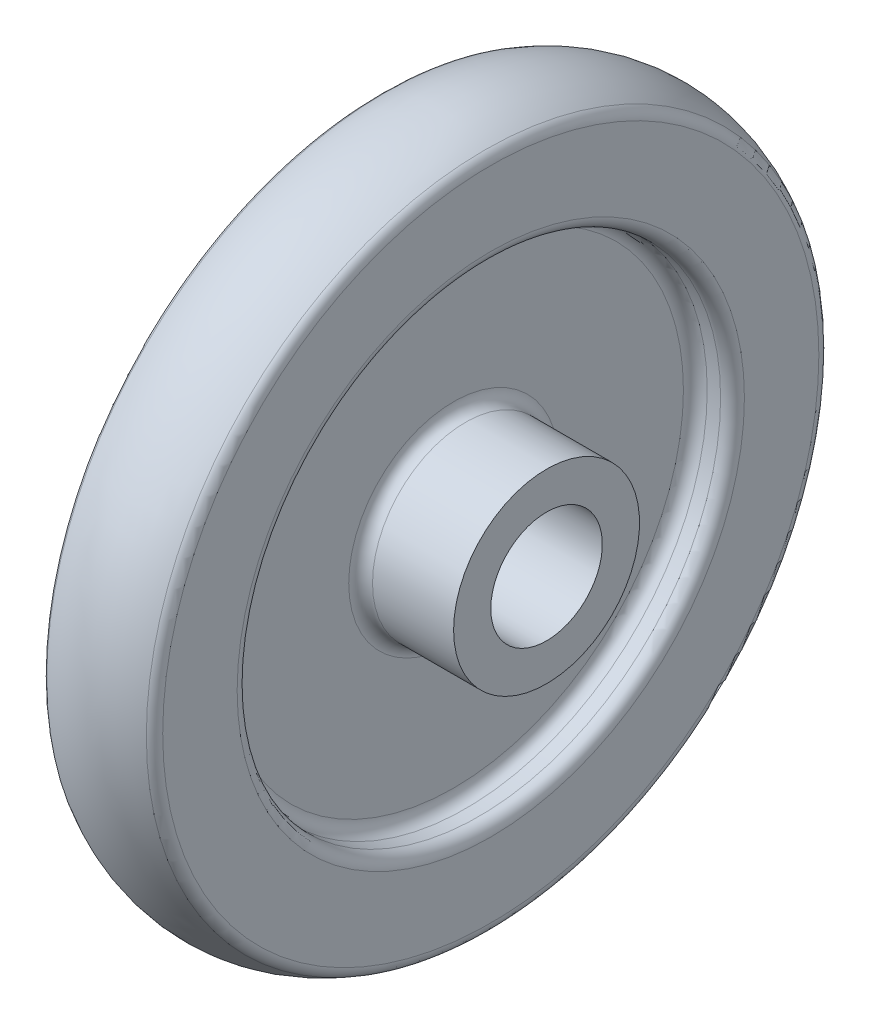
ISO-10303-21;
HEADER;
FILE_DESCRIPTION(('STEP AP214'),'2;1');
FILE_NAME('part.step','',(''),(''),'','','');
FILE_SCHEMA(('AUTOMOTIVE_DESIGN { 1 0 10303 214 1 1 1 1 }'));
ENDSEC;
DATA;
#1=APPLICATION_CONTEXT('core data for automotive mechanical design processes');
#2=APPLICATION_PROTOCOL_DEFINITION('international standard','automotive_design',2000,#1);
#3=PRODUCT_CONTEXT('',#1,'mechanical');
#4=PRODUCT('Part','Part','',(#3));
#5=PRODUCT_RELATED_PRODUCT_CATEGORY('part','',(#4));
#6=PRODUCT_DEFINITION_FORMATION('','',#4);
#7=PRODUCT_DEFINITION_CONTEXT('part definition',#1,'design');
#8=PRODUCT_DEFINITION('design','',#6,#7);
#9=PRODUCT_DEFINITION_SHAPE('','',#8);
#10=(LENGTH_UNIT() NAMED_UNIT(*) SI_UNIT(.MILLI.,.METRE.));
#11=(NAMED_UNIT(*) PLANE_ANGLE_UNIT() SI_UNIT($,.RADIAN.));
#12=(NAMED_UNIT(*) SI_UNIT($,.STERADIAN.) SOLID_ANGLE_UNIT());
#13=UNCERTAINTY_MEASURE_WITH_UNIT(LENGTH_MEASURE(1.E-05),#10,'distance_accuracy_value','');
#14=(GEOMETRIC_REPRESENTATION_CONTEXT(3) GLOBAL_UNCERTAINTY_ASSIGNED_CONTEXT((#13)) GLOBAL_UNIT_ASSIGNED_CONTEXT((#10,
#11,#12)) REPRESENTATION_CONTEXT('',''));
#15=CARTESIAN_POINT('',(0.,0.,0.));
#16=DIRECTION('',(0.,0.,1.));
#17=DIRECTION('',(1.,0.,0.));
#18=AXIS2_PLACEMENT_3D('',#15,#16,#17);
#19=CARTESIAN_POINT('',(0.,9.52500000000001,0.));
#20=DIRECTION('',(1.,0.,0.));
#21=DIRECTION('',(0.,0.,-1.));
#22=AXIS2_PLACEMENT_3D('',#19,#20,#21);
#23=PLANE('',#22);
#24=CARTESIAN_POINT('',(0.,0.,0.));
#25=DIRECTION('',(-1.,0.,0.));
#26=DIRECTION('',(0.,0.,1.));
#27=AXIS2_PLACEMENT_3D('',#24,#25,#26);
#28=CIRCLE('',#27,9.525);
#29=CARTESIAN_POINT('',(0.,0.,9.525));
#30=VERTEX_POINT('',#29);
#31=EDGE_CURVE('E95',#30,#30,#28,.T.);
#32=ORIENTED_EDGE('',*,*,#31,.F.);
#33=EDGE_LOOP('',(#32));
#34=FACE_BOUND('',#33,.T.);
#35=CARTESIAN_POINT('',(0.,0.,0.));
#36=DIRECTION('',(-1.,0.,0.));
#37=DIRECTION('',(0.,0.,1.));
#38=AXIS2_PLACEMENT_3D('',#35,#36,#37);
#39=CIRCLE('',#38,15.875);
#40=CARTESIAN_POINT('',(0.,0.,15.875));
#41=VERTEX_POINT('',#40);
#42=EDGE_CURVE('E10',#41,#41,#39,.T.);
#43=ORIENTED_EDGE('',*,*,#42,.T.);
#44=EDGE_LOOP('',(#43));
#45=FACE_BOUND('',#44,.T.);
#46=ADVANCED_FACE('F31',(#34,#45),#23,.F.);
#47=CARTESIAN_POINT('',(0.,0.,0.));
#48=DIRECTION('',(-1.,0.,0.));
#49=DIRECTION('',(0.,0.,1.));
#50=AXIS2_PLACEMENT_3D('',#47,#48,#49);
#51=CYLINDRICAL_SURFACE('',#50,15.875);
#52=ORIENTED_EDGE('',*,*,#42,.F.);
#53=EDGE_LOOP('',(#52));
#54=FACE_BOUND('',#53,.T.);
#55=CARTESIAN_POINT('',(13.843,0.,0.));
#56=DIRECTION('',(-1.,0.,0.));
#57=DIRECTION('',(0.,0.,1.));
#58=AXIS2_PLACEMENT_3D('',#55,#56,#57);
#59=CIRCLE('',#58,15.875);
#60=CARTESIAN_POINT('',(13.843,0.,15.875));
#61=VERTEX_POINT('',#60);
#62=EDGE_CURVE('E37',#61,#61,#59,.T.);
#63=ORIENTED_EDGE('',*,*,#62,.T.);
#64=EDGE_LOOP('',(#63));
#65=FACE_BOUND('',#64,.T.);
#66=ADVANCED_FACE('F102',(#54,#65),#51,.T.);
#67=CARTESIAN_POINT('',(13.843,0.,0.));
#68=DIRECTION('',(-1.,0.,0.));
#69=DIRECTION('',(0.,0.,1.));
#70=AXIS2_PLACEMENT_3D('',#67,#68,#69);
#71=TOROIDAL_SURFACE('',#70,17.907,2.032);
#72=ORIENTED_EDGE('',*,*,#62,.F.);
#73=EDGE_LOOP('',(#72));
#74=FACE_BOUND('',#73,.T.);
#75=CARTESIAN_POINT('',(15.875,0.,0.));
#76=DIRECTION('',(-1.,0.,0.));
#77=DIRECTION('',(0.,0.,1.));
#78=AXIS2_PLACEMENT_3D('',#75,#76,#77);
#79=CIRCLE('',#78,17.907);
#80=CARTESIAN_POINT('',(15.875,0.,17.907));
#81=VERTEX_POINT('',#80);
#82=EDGE_CURVE('E41',#81,#81,#79,.T.);
#83=ORIENTED_EDGE('',*,*,#82,.T.);
#84=EDGE_LOOP('',(#83));
#85=FACE_BOUND('',#84,.T.);
#86=ADVANCED_FACE('F106',(#74,#85),#71,.F.);
#87=CARTESIAN_POINT('',(15.875,17.907,0.));
#88=DIRECTION('',(1.,0.,0.));
#89=DIRECTION('',(0.,0.,-1.));
#90=AXIS2_PLACEMENT_3D('',#87,#88,#89);
#91=PLANE('',#90);
#92=ORIENTED_EDGE('',*,*,#82,.F.);
#93=EDGE_LOOP('',(#92));
#94=FACE_BOUND('',#93,.T.);
#95=CARTESIAN_POINT('',(15.8750000000001,0.,0.));
#96=DIRECTION('',(-1.,0.,0.));
#97=DIRECTION('',(0.,0.,1.));
#98=AXIS2_PLACEMENT_3D('',#95,#96,#97);
#99=CIRCLE('',#98,39.243);
#100=CARTESIAN_POINT('',(15.8750000000001,0.,39.243));
#101=VERTEX_POINT('',#100);
#102=EDGE_CURVE('E45',#101,#101,#99,.T.);
#103=ORIENTED_EDGE('',*,*,#102,.T.);
#104=EDGE_LOOP('',(#103));
#105=FACE_BOUND('',#104,.T.);
#106=ADVANCED_FACE('F111',(#94,#105),#91,.F.);
#107=CARTESIAN_POINT('',(13.8430000000001,0.,0.));
#108=DIRECTION('',(-1.,0.,0.));
#109=DIRECTION('',(0.,0.,1.));
#110=AXIS2_PLACEMENT_3D('',#107,#108,#109);
#111=TOROIDAL_SURFACE('',#110,39.243,2.032);
#112=ORIENTED_EDGE('',*,*,#102,.F.);
#113=EDGE_LOOP('',(#112));
#114=FACE_BOUND('',#113,.T.);
#115=CARTESIAN_POINT('',(13.8430000000001,0.,0.));
#116=DIRECTION('',(-1.,0.,0.));
#117=DIRECTION('',(0.,0.,1.));
#118=AXIS2_PLACEMENT_3D('',#115,#116,#117);
#119=CIRCLE('',#118,41.275);
#120=CARTESIAN_POINT('',(13.8430000000001,0.,41.275));
#121=VERTEX_POINT('',#120);
#122=EDGE_CURVE('E50',#121,#121,#119,.T.);
#123=ORIENTED_EDGE('',*,*,#122,.T.);
#124=EDGE_LOOP('',(#123));
#125=FACE_BOUND('',#124,.T.);
#126=ADVANCED_FACE('F117',(#114,#125),#111,.F.);
#127=CARTESIAN_POINT('',(0.,0.,0.));
#128=DIRECTION('',(-1.,0.,0.));
#129=DIRECTION('',(0.,0.,1.));
#130=AXIS2_PLACEMENT_3D('',#127,#128,#129);
#131=CYLINDRICAL_SURFACE('',#130,41.275);
#132=ORIENTED_EDGE('',*,*,#122,.F.);
#133=EDGE_LOOP('',(#132));
#134=FACE_BOUND('',#133,.T.);
#135=CARTESIAN_POINT('',(11.557,0.,0.));
#136=DIRECTION('',(-1.,0.,0.));
#137=DIRECTION('',(0.,0.,1.));
#138=AXIS2_PLACEMENT_3D('',#135,#136,#137);
#139=CIRCLE('',#138,41.275);
#140=CARTESIAN_POINT('',(11.557,0.,41.275));
#141=VERTEX_POINT('',#140);
#142=EDGE_CURVE('E53',#141,#141,#139,.T.);
#143=ORIENTED_EDGE('',*,*,#142,.T.);
#144=EDGE_LOOP('',(#143));
#145=FACE_BOUND('',#144,.T.);
#146=ADVANCED_FACE('F121',(#134,#145),#131,.F.);
#147=CARTESIAN_POINT('',(11.557,0.,0.));
#148=DIRECTION('',(-1.,0.,0.));
#149=DIRECTION('',(0.,0.,1.));
#150=AXIS2_PLACEMENT_3D('',#147,#148,#149);
#151=TOROIDAL_SURFACE('',#150,43.307,2.032);
#152=ORIENTED_EDGE('',*,*,#142,.F.);
#153=EDGE_LOOP('',(#152));
#154=FACE_BOUND('',#153,.T.);
#155=CARTESIAN_POINT('',(9.525,0.,0.));
#156=DIRECTION('',(-1.,0.,0.));
#157=DIRECTION('',(0.,0.,1.));
#158=AXIS2_PLACEMENT_3D('',#155,#156,#157);
#159=CIRCLE('',#158,43.307);
#160=CARTESIAN_POINT('',(9.525,0.,43.307));
#161=VERTEX_POINT('',#160);
#162=EDGE_CURVE('E56',#161,#161,#159,.T.);
#163=ORIENTED_EDGE('',*,*,#162,.T.);
#164=EDGE_LOOP('',(#163));
#165=FACE_BOUND('',#164,.T.);
#166=ADVANCED_FACE('F125',(#154,#165),#151,.T.);
#167=CARTESIAN_POINT('',(9.52500000000001,43.307,0.));
#168=DIRECTION('',(1.,0.,0.));
#169=DIRECTION('',(0.,0.,-1.));
#170=AXIS2_PLACEMENT_3D('',#167,#168,#169);
#171=PLANE('',#170);
#172=ORIENTED_EDGE('',*,*,#162,.F.);
#173=EDGE_LOOP('',(#172));
#174=FACE_BOUND('',#173,.T.);
#175=CARTESIAN_POINT('',(9.52500000000001,0.,0.));
#176=DIRECTION('',(-1.,0.,0.));
#177=DIRECTION('',(0.,0.,1.));
#178=AXIS2_PLACEMENT_3D('',#175,#176,#177);
#179=CIRCLE('',#178,56.016390606059);
#180=CARTESIAN_POINT('',(9.52500000000001,0.,56.016390606059));
#181=VERTEX_POINT('',#180);
#182=EDGE_CURVE('E59',#181,#181,#179,.T.);
#183=ORIENTED_EDGE('',*,*,#182,.T.);
#184=EDGE_LOOP('',(#183));
#185=FACE_BOUND('',#184,.T.);
#186=ADVANCED_FACE('F129',(#174,#185),#171,.F.);
#187=CARTESIAN_POINT('',(11.557,0.,0.));
#188=DIRECTION('',(-1.,0.,0.));
#189=DIRECTION('',(0.,0.,1.));
#190=AXIS2_PLACEMENT_3D('',#187,#188,#189);
#191=TOROIDAL_SURFACE('',#190,56.016390606059,2.03199999999999);
#192=ORIENTED_EDGE('',*,*,#182,.F.);
#193=EDGE_LOOP('',(#192));
#194=FACE_BOUND('',#193,.T.);
#195=CARTESIAN_POINT('',(10.5529153281033,0.,0.));
#196=DIRECTION('',(-1.,0.,0.));
#197=DIRECTION('',(0.,0.,1.));
#198=AXIS2_PLACEMENT_3D('',#195,#196,#197);
#199=CIRCLE('',#198,57.7829799674167);
#200=CARTESIAN_POINT('',(10.5529153281033,0.,57.7829799674167));
#201=VERTEX_POINT('',#200);
#202=EDGE_CURVE('E62',#201,#201,#199,.T.);
#203=ORIENTED_EDGE('',*,*,#202,.T.);
#204=EDGE_LOOP('',(#203));
#205=FACE_BOUND('',#204,.T.);
#206=ADVANCED_FACE('F133',(#194,#205),#191,.T.);
#207=CARTESIAN_POINT('',(19.0500000000001,0.,0.));
#208=DIRECTION('',(-1.,0.,0.));
#209=DIRECTION('',(0.,0.,1.));
#210=AXIS2_PLACEMENT_3D('',#207,#208,#209);
#211=TOROIDAL_SURFACE('',#210,42.8331855884499,17.1958367023756);
#212=ORIENTED_EDGE('',*,*,#202,.F.);
#213=EDGE_LOOP('',(#212));
#214=FACE_BOUND('',#213,.T.);
#215=CARTESIAN_POINT('',(27.5470846718968,0.,0.));
#216=DIRECTION('',(-1.,0.,0.));
#217=DIRECTION('',(0.,0.,1.));
#218=AXIS2_PLACEMENT_3D('',#215,#216,#217);
#219=CIRCLE('',#218,57.7829799674167);
#220=CARTESIAN_POINT('',(27.5470846718968,0.,57.7829799674167));
#221=VERTEX_POINT('',#220);
#222=EDGE_CURVE('E65',#221,#221,#219,.T.);
#223=ORIENTED_EDGE('',*,*,#222,.T.);
#224=EDGE_LOOP('',(#223));
#225=FACE_BOUND('',#224,.T.);
#226=ADVANCED_FACE('F137',(#214,#225),#211,.T.);
#227=CARTESIAN_POINT('',(26.5430000000001,0.,0.));
#228=DIRECTION('',(-1.,0.,0.));
#229=DIRECTION('',(0.,0.,1.));
#230=AXIS2_PLACEMENT_3D('',#227,#228,#229);
#231=TOROIDAL_SURFACE('',#230,56.016390606059,2.03199999999999);
#232=ORIENTED_EDGE('',*,*,#222,.F.);
#233=EDGE_LOOP('',(#232));
#234=FACE_BOUND('',#233,.T.);
#235=CARTESIAN_POINT('',(28.5750000000001,0.,0.));
#236=DIRECTION('',(-1.,0.,0.));
#237=DIRECTION('',(0.,0.,1.));
#238=AXIS2_PLACEMENT_3D('',#235,#236,#237);
#239=CIRCLE('',#238,56.016390606059);
#240=CARTESIAN_POINT('',(28.5750000000001,0.,56.016390606059));
#241=VERTEX_POINT('',#240);
#242=EDGE_CURVE('E68',#241,#241,#239,.T.);
#243=ORIENTED_EDGE('',*,*,#242,.T.);
#244=EDGE_LOOP('',(#243));
#245=FACE_BOUND('',#244,.T.);
#246=ADVANCED_FACE('F141',(#234,#245),#231,.T.);
#247=CARTESIAN_POINT('',(28.5750000000001,43.307,0.));
#248=DIRECTION('',(-1.,0.,0.));
#249=DIRECTION('',(0.,0.,1.));
#250=AXIS2_PLACEMENT_3D('',#247,#248,#249);
#251=PLANE('',#250);
#252=ORIENTED_EDGE('',*,*,#242,.F.);
#253=EDGE_LOOP('',(#252));
#254=FACE_BOUND('',#253,.T.);
#255=CARTESIAN_POINT('',(28.5750000000001,0.,0.));
#256=DIRECTION('',(-1.,0.,0.));
#257=DIRECTION('',(0.,0.,1.));
#258=AXIS2_PLACEMENT_3D('',#255,#256,#257);
#259=CIRCLE('',#258,43.307);
#260=CARTESIAN_POINT('',(28.5750000000001,0.,43.307));
#261=VERTEX_POINT('',#260);
#262=EDGE_CURVE('E71',#261,#261,#259,.T.);
#263=ORIENTED_EDGE('',*,*,#262,.T.);
#264=EDGE_LOOP('',(#263));
#265=FACE_BOUND('',#264,.T.);
#266=ADVANCED_FACE('F145',(#254,#265),#251,.F.);
#267=CARTESIAN_POINT('',(26.5430000000001,0.,0.));
#268=DIRECTION('',(-1.,0.,0.));
#269=DIRECTION('',(0.,0.,1.));
#270=AXIS2_PLACEMENT_3D('',#267,#268,#269);
#271=TOROIDAL_SURFACE('',#270,43.307,2.032);
#272=ORIENTED_EDGE('',*,*,#262,.F.);
#273=EDGE_LOOP('',(#272));
#274=FACE_BOUND('',#273,.T.);
#275=CARTESIAN_POINT('',(26.5430000000001,0.,0.));
#276=DIRECTION('',(-1.,0.,0.));
#277=DIRECTION('',(0.,0.,1.));
#278=AXIS2_PLACEMENT_3D('',#275,#276,#277);
#279=CIRCLE('',#278,41.275);
#280=CARTESIAN_POINT('',(26.5430000000001,0.,41.275));
#281=VERTEX_POINT('',#280);
#282=EDGE_CURVE('E74',#281,#281,#279,.T.);
#283=ORIENTED_EDGE('',*,*,#282,.T.);
#284=EDGE_LOOP('',(#283));
#285=FACE_BOUND('',#284,.T.);
#286=ADVANCED_FACE('F149',(#274,#285),#271,.T.);
#287=CARTESIAN_POINT('',(0.,0.,0.));
#288=DIRECTION('',(-1.,0.,0.));
#289=DIRECTION('',(0.,0.,1.));
#290=AXIS2_PLACEMENT_3D('',#287,#288,#289);
#291=CYLINDRICAL_SURFACE('',#290,41.275);
#292=ORIENTED_EDGE('',*,*,#282,.F.);
#293=EDGE_LOOP('',(#292));
#294=FACE_BOUND('',#293,.T.);
#295=CARTESIAN_POINT('',(24.2570000000001,0.,0.));
#296=DIRECTION('',(-1.,0.,0.));
#297=DIRECTION('',(0.,0.,1.));
#298=AXIS2_PLACEMENT_3D('',#295,#296,#297);
#299=CIRCLE('',#298,41.275);
#300=CARTESIAN_POINT('',(24.2570000000001,0.,41.275));
#301=VERTEX_POINT('',#300);
#302=EDGE_CURVE('E77',#301,#301,#299,.T.);
#303=ORIENTED_EDGE('',*,*,#302,.T.);
#304=EDGE_LOOP('',(#303));
#305=FACE_BOUND('',#304,.T.);
#306=ADVANCED_FACE('F153',(#294,#305),#291,.F.);
#307=CARTESIAN_POINT('',(24.2570000000001,0.,0.));
#308=DIRECTION('',(-1.,0.,0.));
#309=DIRECTION('',(0.,0.,1.));
#310=AXIS2_PLACEMENT_3D('',#307,#308,#309);
#311=TOROIDAL_SURFACE('',#310,39.243,2.032);
#312=ORIENTED_EDGE('',*,*,#302,.F.);
#313=EDGE_LOOP('',(#312));
#314=FACE_BOUND('',#313,.T.);
#315=CARTESIAN_POINT('',(22.2250000000001,0.,0.));
#316=DIRECTION('',(-1.,0.,0.));
#317=DIRECTION('',(0.,0.,1.));
#318=AXIS2_PLACEMENT_3D('',#315,#316,#317);
#319=CIRCLE('',#318,39.243);
#320=CARTESIAN_POINT('',(22.2250000000001,0.,39.243));
#321=VERTEX_POINT('',#320);
#322=EDGE_CURVE('E80',#321,#321,#319,.T.);
#323=ORIENTED_EDGE('',*,*,#322,.T.);
#324=EDGE_LOOP('',(#323));
#325=FACE_BOUND('',#324,.T.);
#326=ADVANCED_FACE('F157',(#314,#325),#311,.F.);
#327=CARTESIAN_POINT('',(22.225,17.907,0.));
#328=DIRECTION('',(-1.,0.,0.));
#329=DIRECTION('',(0.,0.,1.));
#330=AXIS2_PLACEMENT_3D('',#327,#328,#329);
#331=PLANE('',#330);
#332=ORIENTED_EDGE('',*,*,#322,.F.);
#333=EDGE_LOOP('',(#332));
#334=FACE_BOUND('',#333,.T.);
#335=CARTESIAN_POINT('',(22.225,0.,0.));
#336=DIRECTION('',(-1.,0.,0.));
#337=DIRECTION('',(0.,0.,1.));
#338=AXIS2_PLACEMENT_3D('',#335,#336,#337);
#339=CIRCLE('',#338,17.907);
#340=CARTESIAN_POINT('',(22.225,0.,17.907));
#341=VERTEX_POINT('',#340);
#342=EDGE_CURVE('E83',#341,#341,#339,.T.);
#343=ORIENTED_EDGE('',*,*,#342,.T.);
#344=EDGE_LOOP('',(#343));
#345=FACE_BOUND('',#344,.T.);
#346=ADVANCED_FACE('F161',(#334,#345),#331,.F.);
#347=CARTESIAN_POINT('',(24.257,0.,0.));
#348=DIRECTION('',(-1.,0.,0.));
#349=DIRECTION('',(0.,0.,1.));
#350=AXIS2_PLACEMENT_3D('',#347,#348,#349);
#351=TOROIDAL_SURFACE('',#350,17.907,2.032);
#352=ORIENTED_EDGE('',*,*,#342,.F.);
#353=EDGE_LOOP('',(#352));
#354=FACE_BOUND('',#353,.T.);
#355=CARTESIAN_POINT('',(24.257,0.,0.));
#356=DIRECTION('',(-1.,0.,0.));
#357=DIRECTION('',(0.,0.,1.));
#358=AXIS2_PLACEMENT_3D('',#355,#356,#357);
#359=CIRCLE('',#358,15.875);
#360=CARTESIAN_POINT('',(24.257,0.,15.875));
#361=VERTEX_POINT('',#360);
#362=EDGE_CURVE('E86',#361,#361,#359,.T.);
#363=ORIENTED_EDGE('',*,*,#362,.T.);
#364=EDGE_LOOP('',(#363));
#365=FACE_BOUND('',#364,.T.);
#366=ADVANCED_FACE('F165',(#354,#365),#351,.F.);
#367=CARTESIAN_POINT('',(0.,0.,0.));
#368=DIRECTION('',(-1.,0.,0.));
#369=DIRECTION('',(0.,0.,1.));
#370=AXIS2_PLACEMENT_3D('',#367,#368,#369);
#371=CYLINDRICAL_SURFACE('',#370,15.875);
#372=ORIENTED_EDGE('',*,*,#362,.F.);
#373=EDGE_LOOP('',(#372));
#374=FACE_BOUND('',#373,.T.);
#375=CARTESIAN_POINT('',(38.1,0.,0.));
#376=DIRECTION('',(-1.,0.,0.));
#377=DIRECTION('',(0.,0.,1.));
#378=AXIS2_PLACEMENT_3D('',#375,#376,#377);
#379=CIRCLE('',#378,15.875);
#380=CARTESIAN_POINT('',(38.1,0.,15.875));
#381=VERTEX_POINT('',#380);
#382=EDGE_CURVE('E89',#381,#381,#379,.T.);
#383=ORIENTED_EDGE('',*,*,#382,.T.);
#384=EDGE_LOOP('',(#383));
#385=FACE_BOUND('',#384,.T.);
#386=ADVANCED_FACE('F169',(#374,#385),#371,.T.);
#387=CARTESIAN_POINT('',(38.1,9.52500000000001,0.));
#388=DIRECTION('',(-1.,0.,0.));
#389=DIRECTION('',(0.,0.,1.));
#390=AXIS2_PLACEMENT_3D('',#387,#388,#389);
#391=PLANE('',#390);
#392=ORIENTED_EDGE('',*,*,#382,.F.);
#393=EDGE_LOOP('',(#392));
#394=FACE_BOUND('',#393,.T.);
#395=CARTESIAN_POINT('',(38.1,0.,0.));
#396=DIRECTION('',(-1.,0.,0.));
#397=DIRECTION('',(0.,0.,1.));
#398=AXIS2_PLACEMENT_3D('',#395,#396,#397);
#399=CIRCLE('',#398,9.525);
#400=CARTESIAN_POINT('',(38.1,0.,9.525));
#401=VERTEX_POINT('',#400);
#402=EDGE_CURVE('E92',#401,#401,#399,.T.);
#403=ORIENTED_EDGE('',*,*,#402,.T.);
#404=EDGE_LOOP('',(#403));
#405=FACE_BOUND('',#404,.T.);
#406=ADVANCED_FACE('F173',(#394,#405),#391,.F.);
#407=CARTESIAN_POINT('',(0.,0.,0.));
#408=DIRECTION('',(-1.,0.,0.));
#409=DIRECTION('',(0.,0.,1.));
#410=AXIS2_PLACEMENT_3D('',#407,#408,#409);
#411=CYLINDRICAL_SURFACE('',#410,9.525);
#412=ORIENTED_EDGE('',*,*,#402,.F.);
#413=EDGE_LOOP('',(#412));
#414=FACE_BOUND('',#413,.T.);
#415=ORIENTED_EDGE('',*,*,#31,.T.);
#416=EDGE_LOOP('',(#415));
#417=FACE_BOUND('',#416,.T.);
#418=ADVANCED_FACE('F99',(#414,#417),#411,.F.);
#419=CLOSED_SHELL('',(#46,#66,#86,#106,#126,#146,#166,#186,#206,#226,#246,#266,#286,#306,#326,
#346,#366,#386,#406,#418));
#420=MANIFOLD_SOLID_BREP('B2',#419);
#421=ADVANCED_BREP_SHAPE_REPRESENTATION('',(#18,#420),#14);
#422=SHAPE_DEFINITION_REPRESENTATION(#9,#421);
ENDSEC;
END-ISO-10303-21;
